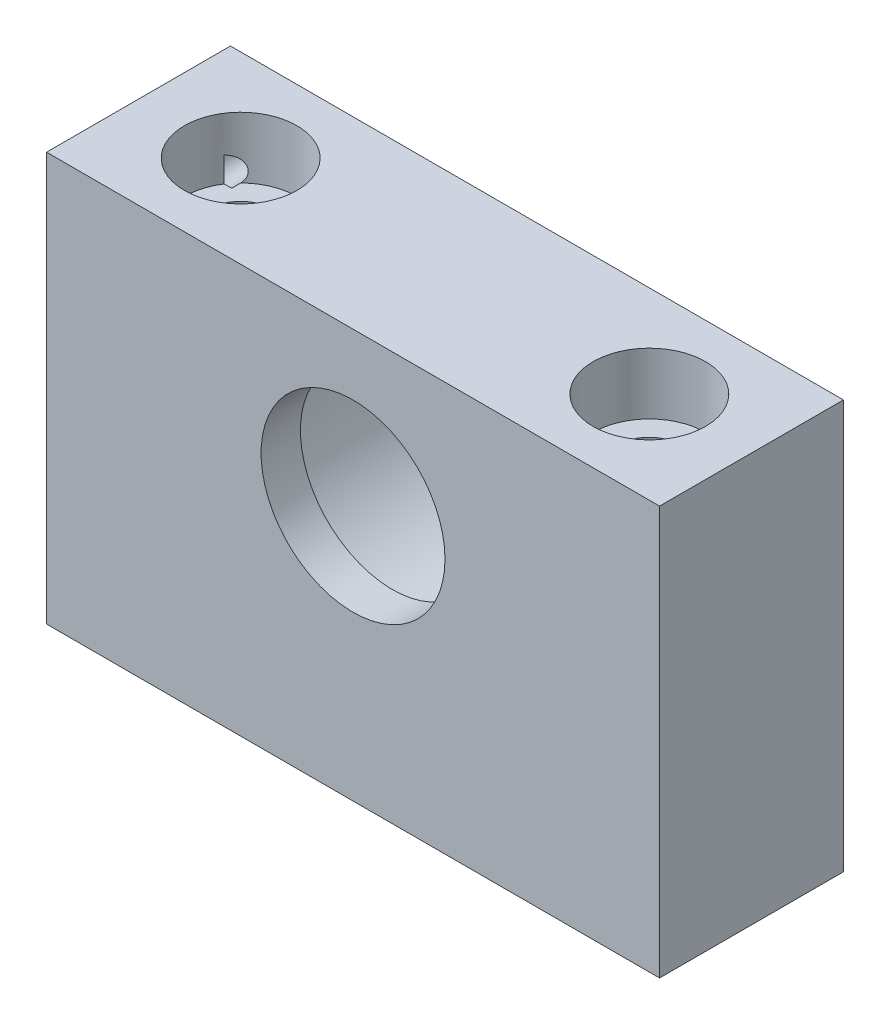
ISO-10303-21;
HEADER;
FILE_DESCRIPTION(('STEP AP214'),'2;1');
FILE_NAME('part.step','',(''),(''),'','','');
FILE_SCHEMA(('AUTOMOTIVE_DESIGN { 1 0 10303 214 1 1 1 1 }'));
ENDSEC;
DATA;
#1=APPLICATION_CONTEXT('core data for automotive mechanical design processes');
#2=APPLICATION_PROTOCOL_DEFINITION('international standard','automotive_design',2000,#1);
#3=PRODUCT_CONTEXT('',#1,'mechanical');
#4=PRODUCT('Part','Part','',(#3));
#5=PRODUCT_RELATED_PRODUCT_CATEGORY('part','',(#4));
#6=PRODUCT_DEFINITION_FORMATION('','',#4);
#7=PRODUCT_DEFINITION_CONTEXT('part definition',#1,'design');
#8=PRODUCT_DEFINITION('design','',#6,#7);
#9=PRODUCT_DEFINITION_SHAPE('','',#8);
#10=(LENGTH_UNIT() NAMED_UNIT(*) SI_UNIT(.MILLI.,.METRE.));
#11=(NAMED_UNIT(*) PLANE_ANGLE_UNIT() SI_UNIT($,.RADIAN.));
#12=(NAMED_UNIT(*) SI_UNIT($,.STERADIAN.) SOLID_ANGLE_UNIT());
#13=UNCERTAINTY_MEASURE_WITH_UNIT(LENGTH_MEASURE(1.E-05),#10,'distance_accuracy_value','');
#14=(GEOMETRIC_REPRESENTATION_CONTEXT(3) GLOBAL_UNCERTAINTY_ASSIGNED_CONTEXT((#13)) GLOBAL_UNIT_ASSIGNED_CONTEXT((#10,
#11,#12)) REPRESENTATION_CONTEXT('',''));
#15=CARTESIAN_POINT('',(0.,0.,0.));
#16=DIRECTION('',(0.,0.,1.));
#17=DIRECTION('',(1.,0.,0.));
#18=AXIS2_PLACEMENT_3D('',#15,#16,#17);
#19=CARTESIAN_POINT('',(5.,5.0023,6.0091));
#20=DIRECTION('',(0.,0.,1.));
#21=DIRECTION('',(1.,0.,0.));
#22=AXIS2_PLACEMENT_3D('',#19,#20,#21);
#23=PLANE('',#22);
#24=CARTESIAN_POINT('',(5.,5.0023,6.0091));
#25=DIRECTION('',(0.,0.,1.));
#26=DIRECTION('',(1.,0.,0.));
#27=AXIS2_PLACEMENT_3D('',#24,#25,#26);
#28=CIRCLE('',#27,1.5);
#29=CARTESIAN_POINT('',(6.5,5.0023,6.0091));
#30=VERTEX_POINT('',#29);
#31=EDGE_CURVE('E19',#30,#30,#28,.F.);
#32=ORIENTED_EDGE('',*,*,#31,.T.);
#33=EDGE_LOOP('',(#32));
#34=FACE_BOUND('',#33,.T.);
#35=ADVANCED_FACE('F16',(#34),#23,.F.);
#36=CARTESIAN_POINT('',(55.,5.0023,6.0091));
#37=DIRECTION('',(0.,0.,1.));
#38=DIRECTION('',(1.,0.,0.));
#39=AXIS2_PLACEMENT_3D('',#36,#37,#38);
#40=PLANE('',#39);
#41=CARTESIAN_POINT('',(55.,5.0023,6.0091));
#42=DIRECTION('',(0.,0.,1.));
#43=DIRECTION('',(1.,0.,0.));
#44=AXIS2_PLACEMENT_3D('',#41,#42,#43);
#45=CIRCLE('',#44,1.5);
#46=CARTESIAN_POINT('',(56.5,5.0023,6.0091));
#47=VERTEX_POINT('',#46);
#48=EDGE_CURVE('E97',#47,#47,#45,.F.);
#49=ORIENTED_EDGE('',*,*,#48,.T.);
#50=EDGE_LOOP('',(#49));
#51=FACE_BOUND('',#50,.T.);
#52=ADVANCED_FACE('F185',(#51),#40,.F.);
#53=CARTESIAN_POINT('',(5.,5.0023,0.009099999999989));
#54=DIRECTION('',(0.,0.,1.));
#55=DIRECTION('',(1.,0.,0.));
#56=AXIS2_PLACEMENT_3D('',#53,#54,#55);
#57=CYLINDRICAL_SURFACE('',#56,1.5);
#58=CARTESIAN_POINT('',(5.,5.0023,0.009099999999989));
#59=DIRECTION('',(0.,0.,1.));
#60=DIRECTION('',(1.,0.,0.));
#61=AXIS2_PLACEMENT_3D('',#58,#59,#60);
#62=CIRCLE('',#61,1.5);
#63=CARTESIAN_POINT('',(6.5,5.0023,0.009099999999989));
#64=VERTEX_POINT('',#63);
#65=EDGE_CURVE('E281',#64,#64,#62,.F.);
#66=ORIENTED_EDGE('',*,*,#65,.T.);
#67=EDGE_LOOP('',(#66));
#68=FACE_BOUND('',#67,.T.);
#69=ORIENTED_EDGE('',*,*,#31,.F.);
#70=EDGE_LOOP('',(#69));
#71=FACE_BOUND('',#70,.T.);
#72=ADVANCED_FACE('F182',(#68,#71),#57,.F.);
#73=CARTESIAN_POINT('',(55.,5.0023,0.009099999999989));
#74=DIRECTION('',(0.,0.,1.));
#75=DIRECTION('',(1.,0.,0.));
#76=AXIS2_PLACEMENT_3D('',#73,#74,#75);
#77=CYLINDRICAL_SURFACE('',#76,1.5);
#78=CARTESIAN_POINT('',(55.,5.0023,0.009099999999989));
#79=DIRECTION('',(0.,0.,1.));
#80=DIRECTION('',(1.,0.,0.));
#81=AXIS2_PLACEMENT_3D('',#78,#79,#80);
#82=CIRCLE('',#81,1.5);
#83=CARTESIAN_POINT('',(56.5,5.0023,0.009099999999989));
#84=VERTEX_POINT('',#83);
#85=EDGE_CURVE('E278',#84,#84,#82,.F.);
#86=ORIENTED_EDGE('',*,*,#85,.T.);
#87=EDGE_LOOP('',(#86));
#88=FACE_BOUND('',#87,.T.);
#89=ORIENTED_EDGE('',*,*,#48,.F.);
#90=EDGE_LOOP('',(#89));
#91=FACE_BOUND('',#90,.T.);
#92=ADVANCED_FACE('F177',(#88,#91),#77,.F.);
#93=CARTESIAN_POINT('',(5.,35.0023,0.009099999999989));
#94=DIRECTION('',(0.,0.,1.));
#95=DIRECTION('',(1.,0.,0.));
#96=AXIS2_PLACEMENT_3D('',#93,#94,#95);
#97=CYLINDRICAL_SURFACE('',#96,1.5);
#98=CARTESIAN_POINT('',(5.,35.0023,0.009099999999989));
#99=DIRECTION('',(0.,0.,1.));
#100=DIRECTION('',(1.,0.,0.));
#101=AXIS2_PLACEMENT_3D('',#98,#99,#100);
#102=CIRCLE('',#101,1.5);
#103=CARTESIAN_POINT('',(6.5,35.0023,0.009099999999989));
#104=VERTEX_POINT('',#103);
#105=EDGE_CURVE('E274',#104,#104,#102,.F.);
#106=ORIENTED_EDGE('',*,*,#105,.T.);
#107=EDGE_LOOP('',(#106));
#108=FACE_BOUND('',#107,.T.);
#109=DIRECTION('',(0.,0.,1.));
#110=VECTOR('',#109,1.);
#111=CARTESIAN_POINT('',(6.11803398875,34.0023,9.0091));
#112=LINE('',#111,#110);
#113=CARTESIAN_POINT('',(6.11803398874995,34.0023,5.11290443413073));
#114=VERTEX_POINT('',#113);
#115=CARTESIAN_POINT('',(6.11803398874995,34.0023,6.0091));
#116=VERTEX_POINT('',#115);
#117=EDGE_CURVE('E86',#114,#116,#112,.T.);
#118=ORIENTED_EDGE('',*,*,#117,.F.);
#119=CARTESIAN_POINT('',(6.11803398874986,34.0023,5.11290443413082));
#120=CARTESIAN_POINT('',(6.13913840382581,34.0258972933785,5.09187529087959));
#121=CARTESIAN_POINT('',(6.15982720943021,34.0505314575954,5.07160587703201));
#122=CARTESIAN_POINT('',(6.20014581072306,34.1019002588936,5.03268309575645));
#123=CARTESIAN_POINT('',(6.21977469233236,34.1286366616465,5.01403111506347));
#124=CARTESIAN_POINT('',(6.27688865532951,34.2122878699729,4.96049907017848));
#125=CARTESIAN_POINT('',(6.31235878702803,34.2723803062321,4.92828139909805));
#126=CARTESIAN_POINT('',(6.37577814841132,34.4003338153184,4.87184956234277));
#127=CARTESIAN_POINT('',(6.40368678232606,34.4682341377822,4.84767844403668));
#128=CARTESIAN_POINT('',(6.44955683377256,34.6095427088046,4.80847198290481));
#129=CARTESIAN_POINT('',(6.46756209625829,34.6829250189769,4.79339634265583));
#130=CARTESIAN_POINT('',(6.48657580862767,34.7979489034351,4.7775616540564));
#131=CARTESIAN_POINT('',(6.49159430849444,34.8385205303122,4.77340544351938));
#132=CARTESIAN_POINT('',(6.4983088369343,34.9201543178465,4.76785276599827));
#133=CARTESIAN_POINT('',(6.50000274565294,34.9612167746961,4.76645805982339));
#134=CARTESIAN_POINT('',(6.49999541682543,35.0708780751667,4.76646140454365));
#135=CARTESIAN_POINT('',(6.49526329704301,35.139514019296,4.7703531796235));
#136=CARTESIAN_POINT('',(6.47664471122834,35.2746745725626,4.78581852099951));
#137=CARTESIAN_POINT('',(6.46274839013197,35.3411968278526,4.7974003571801));
#138=CARTESIAN_POINT('',(6.42679443459331,35.4699652076804,4.82786220684606));
#139=CARTESIAN_POINT('',(6.40476456039869,35.5322250330957,4.84671740565518));
#140=CARTESIAN_POINT('',(6.35389996767578,35.6512600428186,4.89120116288429));
#141=CARTESIAN_POINT('',(6.32506495821269,35.7080349924892,4.91683001089861));
#142=CARTESIAN_POINT('',(6.26073657489912,35.8176299245257,4.97550609677553));
#143=CARTESIAN_POINT('',(6.22500050453793,35.8701536889581,5.00883710319254));
#144=CARTESIAN_POINT('',(6.14963213850279,35.9677820174775,5.08132577011175));
#145=CARTESIAN_POINT('',(6.10999938767471,36.0128857132101,5.12048411155437));
#146=CARTESIAN_POINT('',(6.00766385014711,36.1168915637793,5.22506248567753));
#147=CARTESIAN_POINT('',(5.9434921401807,36.1711211560712,5.29370010179735));
#148=CARTESIAN_POINT('',(5.81418110151762,36.2646483267388,5.43999235864749));
#149=CARTESIAN_POINT('',(5.74903887025783,36.3038832803829,5.51768308571546));
#150=CARTESIAN_POINT('',(5.63366941805207,36.3631067182077,5.66365343399682));
#151=CARTESIAN_POINT('',(5.58304945619873,36.3853700620736,5.73073774240499));
#152=CARTESIAN_POINT('',(5.48453140878493,36.4228475670506,5.86781370251614));
#153=CARTESIAN_POINT('',(5.4366127256862,36.4381241070342,5.93777329557079));
#154=CARTESIAN_POINT('',(5.39022777135368,36.4506515755728,6.00909999999982));
#155=B_SPLINE_CURVE_WITH_KNOTS('',3,(#119,#120,#121,#122,#123,#124,#125,#126,#127,#128,#129,
#130,#131,#132,#133,#134,#135,#136,#137,#138,#139,#140,#141,#142,#143,#144,#145,#146,#147,#148,
#149,#150,#151,#152,#153,#154),.UNSPECIFIED.,.F.,.F.,(4,2,2,2,2,2,2,2,2,2,2,2,2,2,2,2,2,4),(0.,
0.113972653458164,0.228042076700822,0.45745906529935,0.688084369694797,0.917680240645287,
1.04075164153434,1.16390149080867,1.36946908093405,1.5752580970766,1.78035114122625,
1.9854529551529,2.19985828820415,2.41428869482044,2.73793403379197,3.06291667036604,
3.32335648437603,3.58142335848931),.UNSPECIFIED.);
#156=CARTESIAN_POINT('',(5.39022777135368,36.4506515755728,6.00909999999991));
#157=VERTEX_POINT('',#156);
#158=EDGE_CURVE('E80',#114,#157,#155,.T.);
#159=ORIENTED_EDGE('',*,*,#158,.T.);
#160=CARTESIAN_POINT('',(5.,35.0023,6.0091));
#161=DIRECTION('',(0.,0.,1.));
#162=DIRECTION('',(1.,0.,0.));
#163=AXIS2_PLACEMENT_3D('',#160,#161,#162);
#164=CIRCLE('',#163,1.5);
#165=EDGE_CURVE('E83',#157,#116,#164,.T.);
#166=ORIENTED_EDGE('',*,*,#165,.T.);
#167=EDGE_LOOP('',(#118,#159,#166));
#168=FACE_BOUND('',#167,.T.);
#169=ADVANCED_FACE('F82',(#108,#168),#97,.F.);
#170=CARTESIAN_POINT('',(5.,35.0023,6.0091));
#171=DIRECTION('',(0.,0.,1.));
#172=DIRECTION('',(1.,0.,0.));
#173=AXIS2_PLACEMENT_3D('',#170,#171,#172);
#174=PLANE('',#173);
#175=ORIENTED_EDGE('',*,*,#165,.F.);
#176=DIRECTION('',(0.,1.,0.));
#177=VECTOR('',#176,1.);
#178=CARTESIAN_POINT('',(5.39022777135369,34.0023,6.0090999999998));
#179=LINE('',#178,#177);
#180=CARTESIAN_POINT('',(5.39022777135362,34.0023,6.0090999999999));
#181=VERTEX_POINT('',#180);
#182=EDGE_CURVE('E90',#157,#181,#179,.F.);
#183=ORIENTED_EDGE('',*,*,#182,.T.);
#184=DIRECTION('',(1.,0.,0.));
#185=VECTOR('',#184,1.);
#186=CARTESIAN_POINT('',(10.,34.0023,6.0091));
#187=LINE('',#186,#185);
#188=EDGE_CURVE('E96',#116,#181,#187,.F.);
#189=ORIENTED_EDGE('',*,*,#188,.F.);
#190=EDGE_LOOP('',(#175,#183,#189));
#191=FACE_BOUND('',#190,.T.);
#192=ADVANCED_FACE('F94',(#191),#174,.F.);
#193=CARTESIAN_POINT('',(10.,34.0023,9.0091));
#194=DIRECTION('',(0.,1.,0.));
#195=DIRECTION('',(0.,0.,1.));
#196=AXIS2_PLACEMENT_3D('',#193,#194,#195);
#197=PLANE('',#196);
#198=CARTESIAN_POINT('',(10.,34.0023,9.0091));
#199=DIRECTION('',(0.,1.,0.));
#200=DIRECTION('',(0.,0.,1.));
#201=AXIS2_PLACEMENT_3D('',#198,#199,#200);
#202=CIRCLE('',#201,3.3);
#203=CARTESIAN_POINT('',(10.,34.0023,12.3091));
#204=VERTEX_POINT('',#203);
#205=EDGE_CURVE('E110',#204,#204,#202,.F.);
#206=ORIENTED_EDGE('',*,*,#205,.T.);
#207=EDGE_LOOP('',(#206));
#208=FACE_BOUND('',#207,.T.);
#209=ORIENTED_EDGE('',*,*,#117,.T.);
#210=ORIENTED_EDGE('',*,*,#188,.T.);
#211=CARTESIAN_POINT('',(10.,34.0023,9.0091));
#212=DIRECTION('',(0.,1.,0.));
#213=DIRECTION('',(0.,0.,1.));
#214=AXIS2_PLACEMENT_3D('',#211,#212,#213);
#215=CIRCLE('',#214,5.5);
#216=EDGE_CURVE('E100',#181,#114,#215,.T.);
#217=ORIENTED_EDGE('',*,*,#216,.T.);
#218=EDGE_LOOP('',(#209,#210,#217));
#219=FACE_BOUND('',#218,.T.);
#220=ADVANCED_FACE('F327',(#208,#219),#197,.T.);
#221=CARTESIAN_POINT('',(55.,35.0023,6.0091));
#222=DIRECTION('',(0.,0.,1.));
#223=DIRECTION('',(1.,0.,0.));
#224=AXIS2_PLACEMENT_3D('',#221,#222,#223);
#225=PLANE('',#224);
#226=DIRECTION('',(0.,1.,0.));
#227=VECTOR('',#226,1.);
#228=CARTESIAN_POINT('',(54.6097722286463,34.0023,6.0090999999998));
#229=LINE('',#228,#227);
#230=CARTESIAN_POINT('',(54.6097722286464,34.0023,6.0090999999999));
#231=VERTEX_POINT('',#230);
#232=CARTESIAN_POINT('',(54.6097722286464,36.4506515755729,6.0090999999999));
#233=VERTEX_POINT('',#232);
#234=EDGE_CURVE('E102',#231,#233,#229,.T.);
#235=ORIENTED_EDGE('',*,*,#234,.T.);
#236=CARTESIAN_POINT('',(55.,35.0023,6.0091));
#237=DIRECTION('',(0.,0.,1.));
#238=DIRECTION('',(1.,0.,0.));
#239=AXIS2_PLACEMENT_3D('',#236,#237,#238);
#240=CIRCLE('',#239,1.5);
#241=CARTESIAN_POINT('',(53.8819660112501,34.0023,6.0091));
#242=VERTEX_POINT('',#241);
#243=EDGE_CURVE('E114',#233,#242,#240,.F.);
#244=ORIENTED_EDGE('',*,*,#243,.T.);
#245=DIRECTION('',(1.,0.,0.));
#246=VECTOR('',#245,1.);
#247=CARTESIAN_POINT('',(50.,34.0023,6.0091));
#248=LINE('',#247,#246);
#249=EDGE_CURVE('E111',#231,#242,#248,.F.);
#250=ORIENTED_EDGE('',*,*,#249,.F.);
#251=EDGE_LOOP('',(#235,#244,#250));
#252=FACE_BOUND('',#251,.T.);
#253=ADVANCED_FACE('F300',(#252),#225,.F.);
#254=CARTESIAN_POINT('',(55.,35.0023,0.009099999999989));
#255=DIRECTION('',(0.,0.,1.));
#256=DIRECTION('',(1.,0.,0.));
#257=AXIS2_PLACEMENT_3D('',#254,#255,#256);
#258=CYLINDRICAL_SURFACE('',#257,1.5);
#259=DIRECTION('',(0.,0.,1.));
#260=VECTOR('',#259,1.);
#261=CARTESIAN_POINT('',(53.88196601125,34.0023,9.0091));
#262=LINE('',#261,#260);
#263=CARTESIAN_POINT('',(53.8819660112501,34.0023,5.11290443413075));
#264=VERTEX_POINT('',#263);
#265=EDGE_CURVE('E107',#242,#264,#262,.F.);
#266=ORIENTED_EDGE('',*,*,#265,.F.);
#267=ORIENTED_EDGE('',*,*,#243,.F.);
#268=CARTESIAN_POINT('',(54.6097722286463,36.4506515755728,6.00909999999982));
#269=CARTESIAN_POINT('',(54.5758605178964,36.4415057466183,5.9569777687411));
#270=CARTESIAN_POINT('',(54.5411553979812,36.4308852707135,5.90559721521642));
#271=CARTESIAN_POINT('',(54.4703767387009,36.406192676102,5.80448987511468));
#272=CARTESIAN_POINT('',(54.4343006598074,36.3921138585672,5.7547665133845));
#273=CARTESIAN_POINT('',(54.3607269724701,36.3598561075471,5.65680882257168));
#274=CARTESIAN_POINT('',(54.3232180283306,36.3416333873467,5.6085971550672));
#275=CARTESIAN_POINT('',(54.2476424289296,36.3006853559123,5.51465171973356));
#276=CARTESIAN_POINT('',(54.2095762493434,36.2779636987471,5.46891597907749));
#277=CARTESIAN_POINT('',(54.1160165880988,36.215972660533,5.3600422581727));
#278=CARTESIAN_POINT('',(54.060494328365,36.1738828304245,5.29848281952475));
#279=CARTESIAN_POINT('',(53.9520277308572,36.0779224620821,5.18317351768726));
#280=CARTESIAN_POINT('',(53.8990735643292,36.0241020355237,5.12939200616219));
#281=CARTESIAN_POINT('',(53.8068722247097,35.9137530177813,5.03906140520715));
#282=CARTESIAN_POINT('',(53.766791999139,35.8590623713954,5.00113200176645));
#283=CARTESIAN_POINT('',(53.6928025230303,35.7412631700389,4.93285810579114));
#284=CARTESIAN_POINT('',(53.6588958829116,35.6781510736241,4.90251681977581));
#285=CARTESIAN_POINT('',(53.5994036991229,35.5442662346651,4.85026804170643));
#286=CARTESIAN_POINT('',(53.5738750724498,35.4734452758332,4.82841805903081));
#287=CARTESIAN_POINT('',(53.5335128091836,35.3266389486261,4.79424518158923));
#288=CARTESIAN_POINT('',(53.5186713521377,35.2506574012149,4.78191531989282));
#289=CARTESIAN_POINT('',(53.5020323647858,35.1059120603445,4.76812533078598));
#290=CARTESIAN_POINT('',(53.4988527425576,35.0374127315734,4.7655129079183));
#291=CARTESIAN_POINT('',(53.5018823606175,34.9007788134763,4.76801219905611));
#292=CARTESIAN_POINT('',(53.5080880773668,34.8326440969002,4.77312101427584));
#293=CARTESIAN_POINT('',(53.5289672652272,34.7018836323352,4.7905031172601));
#294=CARTESIAN_POINT('',(53.5432431153239,34.6391482434169,4.80244027509579));
#295=CARTESIAN_POINT('',(53.5790916633769,34.5174877981997,4.83289939522446));
#296=CARTESIAN_POINT('',(53.6006657496485,34.4585634694063,4.85142261039201));
#297=CARTESIAN_POINT('',(53.6510513885428,34.3431443460252,4.89558638920637));
#298=CARTESIAN_POINT('',(53.6801510742383,34.2868872822687,4.92151604254715));
#299=CARTESIAN_POINT('',(53.7434454327526,34.1807855740186,4.97940516898931));
#300=CARTESIAN_POINT('',(53.7776385190733,34.1309389417734,5.01136276532269));
#301=CARTESIAN_POINT('',(53.8357755950043,34.0557770073772,5.06729915081698));
#302=CARTESIAN_POINT('',(53.8586280215074,34.028379201061,5.08964473518278));
#303=CARTESIAN_POINT('',(53.88196601125,34.0022999999997,5.11290443413057));
#304=B_SPLINE_CURVE_WITH_KNOTS('',3,(#268,#269,#270,#271,#272,#273,#274,#275,#276,#277,#278,
#279,#280,#281,#282,#283,#284,#285,#286,#287,#288,#289,#290,#291,#292,#293,#294,#295,#296,#297,
#298,#299,#300,#301,#302,#303),.UNSPECIFIED.,.F.,.F.,(4,2,2,2,2,2,2,2,2,2,2,2,2,2,2,2,2,4),(0.,
0.188570282116503,0.377508746803004,0.568544931236669,0.759426586524662,1.03738054548567,
1.3141696121951,1.54630109300283,1.77853050075538,2.01230641196627,2.24591108078829,
2.45072700988064,2.65546606399163,2.85090103348959,3.04637320075413,3.25086912774303,
3.45530149079199,3.58142064941639),.UNSPECIFIED.);
#305=EDGE_CURVE('E141',#233,#264,#304,.T.);
#306=ORIENTED_EDGE('',*,*,#305,.T.);
#307=EDGE_LOOP('',(#266,#267,#306));
#308=FACE_BOUND('',#307,.T.);
#309=CARTESIAN_POINT('',(55.,35.0023,0.009099999999989));
#310=DIRECTION('',(0.,0.,1.));
#311=DIRECTION('',(1.,0.,0.));
#312=AXIS2_PLACEMENT_3D('',#309,#310,#311);
#313=CIRCLE('',#312,1.5);
#314=CARTESIAN_POINT('',(56.5,35.0023,0.009099999999989));
#315=VERTEX_POINT('',#314);
#316=EDGE_CURVE('E91',#315,#315,#313,.F.);
#317=ORIENTED_EDGE('',*,*,#316,.T.);
#318=EDGE_LOOP('',(#317));
#319=FACE_BOUND('',#318,.T.);
#320=ADVANCED_FACE('F148',(#308,#319),#258,.F.);
#321=CARTESIAN_POINT('',(50.,34.0023,9.0091));
#322=DIRECTION('',(0.,1.,0.));
#323=DIRECTION('',(0.,0.,1.));
#324=AXIS2_PLACEMENT_3D('',#321,#322,#323);
#325=PLANE('',#324);
#326=CARTESIAN_POINT('',(50.,34.0023,9.0091));
#327=DIRECTION('',(0.,1.,0.));
#328=DIRECTION('',(0.,0.,1.));
#329=AXIS2_PLACEMENT_3D('',#326,#327,#328);
#330=CIRCLE('',#329,3.3);
#331=CARTESIAN_POINT('',(50.,34.0023,12.3091));
#332=VERTEX_POINT('',#331);
#333=EDGE_CURVE('E282',#332,#332,#330,.F.);
#334=ORIENTED_EDGE('',*,*,#333,.T.);
#335=EDGE_LOOP('',(#334));
#336=FACE_BOUND('',#335,.T.);
#337=ORIENTED_EDGE('',*,*,#249,.T.);
#338=ORIENTED_EDGE('',*,*,#265,.T.);
#339=CARTESIAN_POINT('',(50.,34.0023,9.0091));
#340=DIRECTION('',(0.,1.,0.));
#341=DIRECTION('',(0.,0.,1.));
#342=AXIS2_PLACEMENT_3D('',#339,#340,#341);
#343=CIRCLE('',#342,5.5);
#344=EDGE_CURVE('E139',#264,#231,#343,.T.);
#345=ORIENTED_EDGE('',*,*,#344,.T.);
#346=EDGE_LOOP('',(#337,#338,#345));
#347=FACE_BOUND('',#346,.T.);
#348=ADVANCED_FACE('F307',(#336,#347),#325,.T.);
#349=CARTESIAN_POINT('',(30.,25.0023,0.009099999999989));
#350=DIRECTION('',(0.,0.,1.));
#351=DIRECTION('',(1.,0.,0.));
#352=AXIS2_PLACEMENT_3D('',#349,#350,#351);
#353=CYLINDRICAL_SURFACE('',#352,13.);
#354=CARTESIAN_POINT('',(30.,25.0023,0.009099999999989));
#355=DIRECTION('',(0.,0.,1.));
#356=DIRECTION('',(1.,0.,0.));
#357=AXIS2_PLACEMENT_3D('',#354,#355,#356);
#358=CIRCLE('',#357,13.);
#359=CARTESIAN_POINT('',(43.,25.0023,0.009099999999989));
#360=VERTEX_POINT('',#359);
#361=EDGE_CURVE('E270',#360,#360,#358,.F.);
#362=ORIENTED_EDGE('',*,*,#361,.T.);
#363=EDGE_LOOP('',(#362));
#364=FACE_BOUND('',#363,.T.);
#365=CARTESIAN_POINT('',(30.,25.0023,14.1591));
#366=DIRECTION('',(0.,0.,1.));
#367=DIRECTION('',(1.,0.,0.));
#368=AXIS2_PLACEMENT_3D('',#365,#366,#367);
#369=CIRCLE('',#368,13.);
#370=CARTESIAN_POINT('',(43.,25.0023,14.1591));
#371=VERTEX_POINT('',#370);
#372=EDGE_CURVE('E135',#371,#371,#369,.T.);
#373=ORIENTED_EDGE('',*,*,#372,.T.);
#374=EDGE_LOOP('',(#373));
#375=FACE_BOUND('',#374,.T.);
#376=ADVANCED_FACE('F310',(#364,#375),#353,.F.);
#377=CARTESIAN_POINT('',(10.,0.002299999999991,9.0091));
#378=DIRECTION('',(0.,1.,0.));
#379=DIRECTION('',(0.,0.,1.));
#380=AXIS2_PLACEMENT_3D('',#377,#378,#379);
#381=CYLINDRICAL_SURFACE('',#380,3.3);
#382=CARTESIAN_POINT('',(10.,0.002299999999991,9.0091));
#383=DIRECTION('',(0.,1.,0.));
#384=DIRECTION('',(0.,0.,1.));
#385=AXIS2_PLACEMENT_3D('',#382,#383,#384);
#386=CIRCLE('',#385,3.3);
#387=CARTESIAN_POINT('',(10.,0.002299999999991,12.3091));
#388=VERTEX_POINT('',#387);
#389=EDGE_CURVE('E131',#388,#388,#386,.F.);
#390=ORIENTED_EDGE('',*,*,#389,.T.);
#391=EDGE_LOOP('',(#390));
#392=FACE_BOUND('',#391,.T.);
#393=ORIENTED_EDGE('',*,*,#205,.F.);
#394=EDGE_LOOP('',(#393));
#395=FACE_BOUND('',#394,.T.);
#396=ADVANCED_FACE('F262',(#392,#395),#381,.F.);
#397=CARTESIAN_POINT('',(50.,0.002299999999991,9.0091));
#398=DIRECTION('',(0.,1.,0.));
#399=DIRECTION('',(0.,0.,1.));
#400=AXIS2_PLACEMENT_3D('',#397,#398,#399);
#401=CYLINDRICAL_SURFACE('',#400,3.3);
#402=CARTESIAN_POINT('',(50.,0.002299999999991,9.0091));
#403=DIRECTION('',(0.,1.,0.));
#404=DIRECTION('',(0.,0.,1.));
#405=AXIS2_PLACEMENT_3D('',#402,#403,#404);
#406=CIRCLE('',#405,3.3);
#407=CARTESIAN_POINT('',(50.,0.002299999999991,12.3091));
#408=VERTEX_POINT('',#407);
#409=EDGE_CURVE('E127',#408,#408,#406,.F.);
#410=ORIENTED_EDGE('',*,*,#409,.T.);
#411=EDGE_LOOP('',(#410));
#412=FACE_BOUND('',#411,.T.);
#413=ORIENTED_EDGE('',*,*,#333,.F.);
#414=EDGE_LOOP('',(#413));
#415=FACE_BOUND('',#414,.T.);
#416=ADVANCED_FACE('F257',(#412,#415),#401,.F.);
#417=CARTESIAN_POINT('',(0.,0.002299999999991,0.009099999999989));
#418=DIRECTION('',(0.,0.,1.));
#419=DIRECTION('',(1.,0.,0.));
#420=AXIS2_PLACEMENT_3D('',#417,#418,#419);
#421=PLANE('',#420);
#422=ORIENTED_EDGE('',*,*,#316,.F.);
#423=EDGE_LOOP('',(#422));
#424=FACE_BOUND('',#423,.T.);
#425=ORIENTED_EDGE('',*,*,#361,.F.);
#426=EDGE_LOOP('',(#425));
#427=FACE_BOUND('',#426,.T.);
#428=ORIENTED_EDGE('',*,*,#105,.F.);
#429=EDGE_LOOP('',(#428));
#430=FACE_BOUND('',#429,.T.);
#431=ORIENTED_EDGE('',*,*,#85,.F.);
#432=EDGE_LOOP('',(#431));
#433=FACE_BOUND('',#432,.T.);
#434=ORIENTED_EDGE('',*,*,#65,.F.);
#435=EDGE_LOOP('',(#434));
#436=FACE_BOUND('',#435,.T.);
#437=DIRECTION('',(0.,1.,0.));
#438=VECTOR('',#437,1.);
#439=CARTESIAN_POINT('',(60.,0.002299999999991,0.009099999999989));
#440=LINE('',#439,#438);
#441=CARTESIAN_POINT('',(60.,0.002299999999991,0.009099999999989));
#442=VERTEX_POINT('',#441);
#443=CARTESIAN_POINT('',(60.,40.0023,0.009099999999989));
#444=VERTEX_POINT('',#443);
#445=EDGE_CURVE('E237',#442,#444,#440,.T.);
#446=ORIENTED_EDGE('',*,*,#445,.F.);
#447=DIRECTION('',(1.,0.,0.));
#448=VECTOR('',#447,1.);
#449=CARTESIAN_POINT('',(0.,0.002299999999991,0.009099999999989));
#450=LINE('',#449,#448);
#451=CARTESIAN_POINT('',(0.,0.002299999999991,0.009099999999989));
#452=VERTEX_POINT('',#451);
#453=EDGE_CURVE('E245',#442,#452,#450,.F.);
#454=ORIENTED_EDGE('',*,*,#453,.T.);
#455=DIRECTION('',(0.,1.,0.));
#456=VECTOR('',#455,1.);
#457=CARTESIAN_POINT('',(0.,0.002299999999991,0.009099999999989));
#458=LINE('',#457,#456);
#459=CARTESIAN_POINT('',(0.,40.0023,0.009099999999989));
#460=VERTEX_POINT('',#459);
#461=EDGE_CURVE('E138',#452,#460,#458,.T.);
#462=ORIENTED_EDGE('',*,*,#461,.T.);
#463=DIRECTION('',(1.,0.,0.));
#464=VECTOR('',#463,1.);
#465=CARTESIAN_POINT('',(0.,40.0023,0.009099999999989));
#466=LINE('',#465,#464);
#467=EDGE_CURVE('E233',#444,#460,#466,.F.);
#468=ORIENTED_EDGE('',*,*,#467,.F.);
#469=EDGE_LOOP('',(#446,#454,#462,#468));
#470=FACE_BOUND('',#469,.T.);
#471=ADVANCED_FACE('F163',(#424,#427,#430,#433,#436,#470),#421,.F.);
#472=CARTESIAN_POINT('',(10.,34.0023,9.0091));
#473=DIRECTION('',(0.,1.,0.));
#474=DIRECTION('',(0.,0.,1.));
#475=AXIS2_PLACEMENT_3D('',#472,#473,#474);
#476=CYLINDRICAL_SURFACE('',#475,5.5);
#477=CARTESIAN_POINT('',(10.,40.0023,9.0091));
#478=DIRECTION('',(0.,1.,0.));
#479=DIRECTION('',(0.,0.,1.));
#480=AXIS2_PLACEMENT_3D('',#477,#478,#479);
#481=CIRCLE('',#480,5.5);
#482=CARTESIAN_POINT('',(10.,40.0023,14.5091));
#483=VERTEX_POINT('',#482);
#484=EDGE_CURVE('E124',#483,#483,#481,.F.);
#485=ORIENTED_EDGE('',*,*,#484,.F.);
#486=EDGE_LOOP('',(#485));
#487=FACE_BOUND('',#486,.T.);
#488=ORIENTED_EDGE('',*,*,#182,.F.);
#489=ORIENTED_EDGE('',*,*,#158,.F.);
#490=ORIENTED_EDGE('',*,*,#216,.F.);
#491=EDGE_LOOP('',(#488,#489,#490));
#492=FACE_BOUND('',#491,.T.);
#493=ADVANCED_FACE('F99',(#487,#492),#476,.F.);
#494=CARTESIAN_POINT('',(50.,34.0023,9.0091));
#495=DIRECTION('',(0.,1.,0.));
#496=DIRECTION('',(0.,0.,1.));
#497=AXIS2_PLACEMENT_3D('',#494,#495,#496);
#498=CYLINDRICAL_SURFACE('',#497,5.5);
#499=CARTESIAN_POINT('',(50.,40.0023,9.0091));
#500=DIRECTION('',(0.,1.,0.));
#501=DIRECTION('',(0.,0.,1.));
#502=AXIS2_PLACEMENT_3D('',#499,#500,#501);
#503=CIRCLE('',#502,5.5);
#504=CARTESIAN_POINT('',(50.,40.0023,14.5091));
#505=VERTEX_POINT('',#504);
#506=EDGE_CURVE('E121',#505,#505,#503,.F.);
#507=ORIENTED_EDGE('',*,*,#506,.F.);
#508=EDGE_LOOP('',(#507));
#509=FACE_BOUND('',#508,.T.);
#510=ORIENTED_EDGE('',*,*,#305,.F.);
#511=ORIENTED_EDGE('',*,*,#234,.F.);
#512=ORIENTED_EDGE('',*,*,#344,.F.);
#513=EDGE_LOOP('',(#510,#511,#512));
#514=FACE_BOUND('',#513,.T.);
#515=ADVANCED_FACE('F152',(#509,#514),#498,.F.);
#516=CARTESIAN_POINT('',(30.,25.0023,14.1591));
#517=DIRECTION('',(0.,0.,1.));
#518=DIRECTION('',(1.,0.,0.));
#519=AXIS2_PLACEMENT_3D('',#516,#517,#518);
#520=PLANE('',#519);
#521=CARTESIAN_POINT('',(30.,25.0023,14.1591));
#522=DIRECTION('',(0.,0.,1.));
#523=DIRECTION('',(1.,0.,0.));
#524=AXIS2_PLACEMENT_3D('',#521,#522,#523);
#525=CIRCLE('',#524,9.);
#526=CARTESIAN_POINT('',(39.,25.0023,14.1591));
#527=VERTEX_POINT('',#526);
#528=EDGE_CURVE('E117',#527,#527,#525,.T.);
#529=ORIENTED_EDGE('',*,*,#528,.T.);
#530=EDGE_LOOP('',(#529));
#531=FACE_BOUND('',#530,.T.);
#532=ORIENTED_EDGE('',*,*,#372,.F.);
#533=EDGE_LOOP('',(#532));
#534=FACE_BOUND('',#533,.T.);
#535=ADVANCED_FACE('F157',(#531,#534),#520,.F.);
#536=CARTESIAN_POINT('',(0.,0.002299999999991,0.009099999999989));
#537=DIRECTION('',(1.,0.,0.));
#538=DIRECTION('',(0.,0.,-1.));
#539=AXIS2_PLACEMENT_3D('',#536,#537,#538);
#540=PLANE('',#539);
#541=DIRECTION('',(0.,0.,1.));
#542=VECTOR('',#541,1.);
#543=CARTESIAN_POINT('',(0.,40.0023,0.009099999999989));
#544=LINE('',#543,#542);
#545=CARTESIAN_POINT('',(0.,40.0023,18.0091));
#546=VERTEX_POINT('',#545);
#547=EDGE_CURVE('E227',#460,#546,#544,.T.);
#548=ORIENTED_EDGE('',*,*,#547,.F.);
#549=ORIENTED_EDGE('',*,*,#461,.F.);
#550=DIRECTION('',(0.,0.,1.));
#551=VECTOR('',#550,1.);
#552=CARTESIAN_POINT('',(0.,0.002299999999991,0.009099999999989));
#553=LINE('',#552,#551);
#554=CARTESIAN_POINT('',(0.,0.002299999999991,18.0091));
#555=VERTEX_POINT('',#554);
#556=EDGE_CURVE('E134',#452,#555,#553,.T.);
#557=ORIENTED_EDGE('',*,*,#556,.T.);
#558=DIRECTION('',(0.,1.,0.));
#559=VECTOR('',#558,1.);
#560=CARTESIAN_POINT('',(0.,0.002299999999991,18.0091));
#561=LINE('',#560,#559);
#562=EDGE_CURVE('E120',#546,#555,#561,.F.);
#563=ORIENTED_EDGE('',*,*,#562,.F.);
#564=EDGE_LOOP('',(#548,#549,#557,#563));
#565=FACE_BOUND('',#564,.T.);
#566=ADVANCED_FACE('F216',(#565),#540,.F.);
#567=CARTESIAN_POINT('',(0.,0.002299999999991,0.009099999999989));
#568=DIRECTION('',(0.,1.,0.));
#569=DIRECTION('',(0.,0.,1.));
#570=AXIS2_PLACEMENT_3D('',#567,#568,#569);
#571=PLANE('',#570);
#572=ORIENTED_EDGE('',*,*,#409,.F.);
#573=EDGE_LOOP('',(#572));
#574=FACE_BOUND('',#573,.T.);
#575=ORIENTED_EDGE('',*,*,#389,.F.);
#576=EDGE_LOOP('',(#575));
#577=FACE_BOUND('',#576,.T.);
#578=DIRECTION('',(1.,0.,0.));
#579=VECTOR('',#578,1.);
#580=CARTESIAN_POINT('',(0.,0.002299999999991,18.0091));
#581=LINE('',#580,#579);
#582=CARTESIAN_POINT('',(60.,0.002299999999991,18.0091));
#583=VERTEX_POINT('',#582);
#584=EDGE_CURVE('E249',#555,#583,#581,.T.);
#585=ORIENTED_EDGE('',*,*,#584,.F.);
#586=ORIENTED_EDGE('',*,*,#556,.F.);
#587=ORIENTED_EDGE('',*,*,#453,.F.);
#588=DIRECTION('',(0.,0.,-1.));
#589=VECTOR('',#588,1.);
#590=CARTESIAN_POINT('',(60.,0.002299999999991,0.009099999999989));
#591=LINE('',#590,#589);
#592=EDGE_CURVE('E130',#583,#442,#591,.T.);
#593=ORIENTED_EDGE('',*,*,#592,.F.);
#594=EDGE_LOOP('',(#585,#586,#587,#593));
#595=FACE_BOUND('',#594,.T.);
#596=ADVANCED_FACE('F214',(#574,#577,#595),#571,.F.);
#597=CARTESIAN_POINT('',(60.,0.002299999999991,0.009099999999989));
#598=DIRECTION('',(1.,0.,0.));
#599=DIRECTION('',(0.,0.,-1.));
#600=AXIS2_PLACEMENT_3D('',#597,#598,#599);
#601=PLANE('',#600);
#602=DIRECTION('',(0.,0.,1.));
#603=VECTOR('',#602,1.);
#604=CARTESIAN_POINT('',(60.,40.0023,0.009099999999989));
#605=LINE('',#604,#603);
#606=CARTESIAN_POINT('',(60.,40.0023,18.0091));
#607=VERTEX_POINT('',#606);
#608=EDGE_CURVE('E34',#607,#444,#605,.F.);
#609=ORIENTED_EDGE('',*,*,#608,.F.);
#610=DIRECTION('',(0.,1.,0.));
#611=VECTOR('',#610,1.);
#612=CARTESIAN_POINT('',(60.,0.002299999999991,18.0091));
#613=LINE('',#612,#611);
#614=EDGE_CURVE('E251',#583,#607,#613,.T.);
#615=ORIENTED_EDGE('',*,*,#614,.F.);
#616=ORIENTED_EDGE('',*,*,#592,.T.);
#617=ORIENTED_EDGE('',*,*,#445,.T.);
#618=EDGE_LOOP('',(#609,#615,#616,#617));
#619=FACE_BOUND('',#618,.T.);
#620=ADVANCED_FACE('F210',(#619),#601,.T.);
#621=CARTESIAN_POINT('',(0.,40.0023,0.009099999999989));
#622=DIRECTION('',(0.,1.,0.));
#623=DIRECTION('',(0.,0.,1.));
#624=AXIS2_PLACEMENT_3D('',#621,#622,#623);
#625=PLANE('',#624);
#626=ORIENTED_EDGE('',*,*,#506,.T.);
#627=EDGE_LOOP('',(#626));
#628=FACE_BOUND('',#627,.T.);
#629=ORIENTED_EDGE('',*,*,#484,.T.);
#630=EDGE_LOOP('',(#629));
#631=FACE_BOUND('',#630,.T.);
#632=DIRECTION('',(1.,0.,0.));
#633=VECTOR('',#632,1.);
#634=CARTESIAN_POINT('',(0.,40.0023,18.0091));
#635=LINE('',#634,#633);
#636=EDGE_CURVE('E25',#607,#546,#635,.F.);
#637=ORIENTED_EDGE('',*,*,#636,.F.);
#638=ORIENTED_EDGE('',*,*,#608,.T.);
#639=ORIENTED_EDGE('',*,*,#467,.T.);
#640=ORIENTED_EDGE('',*,*,#547,.T.);
#641=EDGE_LOOP('',(#637,#638,#639,#640));
#642=FACE_BOUND('',#641,.T.);
#643=ADVANCED_FACE('F203',(#628,#631,#642),#625,.T.);
#644=CARTESIAN_POINT('',(30.,25.0023,0.009099999999989));
#645=DIRECTION('',(0.,0.,1.));
#646=DIRECTION('',(1.,0.,0.));
#647=AXIS2_PLACEMENT_3D('',#644,#645,#646);
#648=CYLINDRICAL_SURFACE('',#647,9.);
#649=CARTESIAN_POINT('',(30.,25.0023,18.0091));
#650=DIRECTION('',(0.,0.,1.));
#651=DIRECTION('',(1.,0.,0.));
#652=AXIS2_PLACEMENT_3D('',#649,#650,#651);
#653=CIRCLE('',#652,9.);
#654=CARTESIAN_POINT('',(39.,25.0023,18.0091));
#655=VERTEX_POINT('',#654);
#656=EDGE_CURVE('E11',#655,#655,#653,.F.);
#657=ORIENTED_EDGE('',*,*,#656,.F.);
#658=EDGE_LOOP('',(#657));
#659=FACE_BOUND('',#658,.T.);
#660=ORIENTED_EDGE('',*,*,#528,.F.);
#661=EDGE_LOOP('',(#660));
#662=FACE_BOUND('',#661,.T.);
#663=ADVANCED_FACE('F197',(#659,#662),#648,.F.);
#664=CARTESIAN_POINT('',(0.,0.002299999999991,18.0091));
#665=DIRECTION('',(0.,0.,1.));
#666=DIRECTION('',(1.,0.,0.));
#667=AXIS2_PLACEMENT_3D('',#664,#665,#666);
#668=PLANE('',#667);
#669=ORIENTED_EDGE('',*,*,#656,.T.);
#670=EDGE_LOOP('',(#669));
#671=FACE_BOUND('',#670,.T.);
#672=ORIENTED_EDGE('',*,*,#614,.T.);
#673=ORIENTED_EDGE('',*,*,#636,.T.);
#674=ORIENTED_EDGE('',*,*,#562,.T.);
#675=ORIENTED_EDGE('',*,*,#584,.T.);
#676=EDGE_LOOP('',(#672,#673,#674,#675));
#677=FACE_BOUND('',#676,.T.);
#678=ADVANCED_FACE('F195',(#671,#677),#668,.T.);
#679=CLOSED_SHELL('',(#35,#52,#72,#92,#169,#192,#220,#253,#320,#348,#376,#396,#416,#471,#493,
#515,#535,#566,#596,#620,#643,#663,#678));
#680=MANIFOLD_SOLID_BREP('B1',#679);
#681=ADVANCED_BREP_SHAPE_REPRESENTATION('',(#18,#680),#14);
#682=SHAPE_DEFINITION_REPRESENTATION(#9,#681);
ENDSEC;
END-ISO-10303-21;
